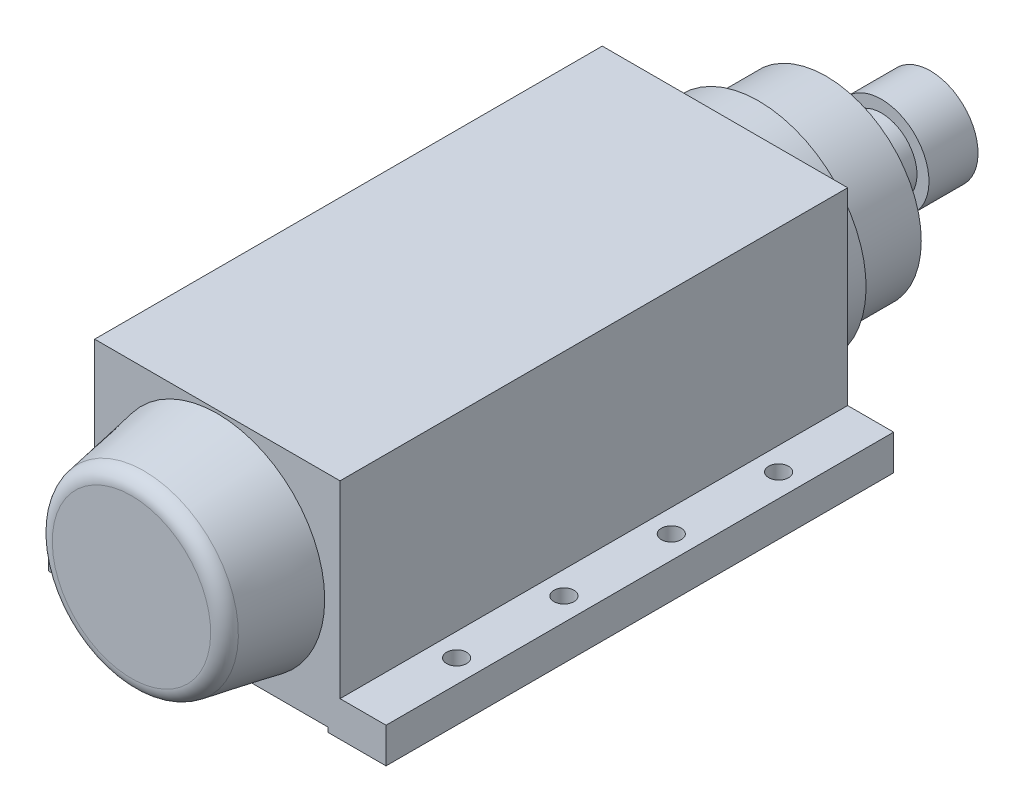
ISO-10303-21;
HEADER;
FILE_DESCRIPTION(('STEP AP214'),'2;1');
FILE_NAME('part.step','',(''),(''),'','','');
FILE_SCHEMA(('AUTOMOTIVE_DESIGN { 1 0 10303 214 1 1 1 1 }'));
ENDSEC;
DATA;
#1=APPLICATION_CONTEXT('core data for automotive mechanical design processes');
#2=APPLICATION_PROTOCOL_DEFINITION('international standard','automotive_design',2000,#1);
#3=PRODUCT_CONTEXT('',#1,'mechanical');
#4=PRODUCT('Part','Part','',(#3));
#5=PRODUCT_RELATED_PRODUCT_CATEGORY('part','',(#4));
#6=PRODUCT_DEFINITION_FORMATION('','',#4);
#7=PRODUCT_DEFINITION_CONTEXT('part definition',#1,'design');
#8=PRODUCT_DEFINITION('design','',#6,#7);
#9=PRODUCT_DEFINITION_SHAPE('','',#8);
#10=(LENGTH_UNIT() NAMED_UNIT(*) SI_UNIT(.MILLI.,.METRE.));
#11=(NAMED_UNIT(*) PLANE_ANGLE_UNIT() SI_UNIT($,.RADIAN.));
#12=(NAMED_UNIT(*) SI_UNIT($,.STERADIAN.) SOLID_ANGLE_UNIT());
#13=UNCERTAINTY_MEASURE_WITH_UNIT(LENGTH_MEASURE(1.E-05),#10,'distance_accuracy_value','');
#14=(GEOMETRIC_REPRESENTATION_CONTEXT(3) GLOBAL_UNCERTAINTY_ASSIGNED_CONTEXT((#13)) GLOBAL_UNIT_ASSIGNED_CONTEXT((#10,
#11,#12)) REPRESENTATION_CONTEXT('',''));
#15=CARTESIAN_POINT('',(0.,0.,0.));
#16=DIRECTION('',(0.,0.,1.));
#17=DIRECTION('',(1.,0.,0.));
#18=AXIS2_PLACEMENT_3D('',#15,#16,#17);
#19=CARTESIAN_POINT('',(36.,1.5,165.5));
#20=DIRECTION('',(1.,0.,0.));
#21=DIRECTION('',(0.,0.,-1.));
#22=AXIS2_PLACEMENT_3D('',#19,#20,#21);
#23=PLANE('',#22);
#24=DIRECTION('',(0.,-1.,0.));
#25=VECTOR('',#24,1.);
#26=CARTESIAN_POINT('',(36.,1.5,0.));
#27=LINE('',#26,#25);
#28=CARTESIAN_POINT('',(36.,1.5,0.));
#29=VERTEX_POINT('',#28);
#30=CARTESIAN_POINT('',(36.,0.,0.));
#31=VERTEX_POINT('',#30);
#32=EDGE_CURVE('E158',#29,#31,#27,.T.);
#33=ORIENTED_EDGE('',*,*,#32,.T.);
#34=DIRECTION('',(0.,0.,-1.));
#35=VECTOR('',#34,1.);
#36=CARTESIAN_POINT('',(36.,0.,165.5));
#37=LINE('',#36,#35);
#38=CARTESIAN_POINT('',(36.,0.,165.5));
#39=VERTEX_POINT('',#38);
#40=EDGE_CURVE('E44',#39,#31,#37,.T.);
#41=ORIENTED_EDGE('',*,*,#40,.F.);
#42=DIRECTION('',(0.,-1.,0.));
#43=VECTOR('',#42,1.);
#44=CARTESIAN_POINT('',(36.,1.5,165.5));
#45=LINE('',#44,#43);
#46=CARTESIAN_POINT('',(36.,1.5,165.5));
#47=VERTEX_POINT('',#46);
#48=EDGE_CURVE('E181',#47,#39,#45,.T.);
#49=ORIENTED_EDGE('',*,*,#48,.F.);
#50=DIRECTION('',(0.,0.,-1.));
#51=VECTOR('',#50,1.);
#52=CARTESIAN_POINT('',(36.,1.5,165.5));
#53=LINE('',#52,#51);
#54=EDGE_CURVE('E154',#47,#29,#53,.T.);
#55=ORIENTED_EDGE('',*,*,#54,.T.);
#56=EDGE_LOOP('',(#33,#41,#49,#55));
#57=FACE_BOUND('',#56,.T.);
#58=ADVANCED_FACE('F35',(#57),#23,.F.);
#59=CARTESIAN_POINT('',(36.,0.,165.5));
#60=DIRECTION('',(0.,1.,0.));
#61=DIRECTION('',(-1.,0.,0.));
#62=AXIS2_PLACEMENT_3D('',#59,#60,#61);
#63=PLANE('',#62);
#64=CARTESIAN_POINT('',(47.5,0.,135.));
#65=DIRECTION('',(0.,-1.,0.));
#66=DIRECTION('',(1.,0.,0.));
#67=AXIS2_PLACEMENT_3D('',#64,#65,#66);
#68=CIRCLE('',#67,3.25);
#69=CARTESIAN_POINT('',(50.75,0.,135.));
#70=VERTEX_POINT('',#69);
#71=EDGE_CURVE('E363',#70,#70,#68,.T.);
#72=ORIENTED_EDGE('',*,*,#71,.F.);
#73=EDGE_LOOP('',(#72));
#74=FACE_BOUND('',#73,.T.);
#75=CARTESIAN_POINT('',(47.5,0.,100.));
#76=DIRECTION('',(0.,-1.,0.));
#77=DIRECTION('',(1.,0.,0.));
#78=AXIS2_PLACEMENT_3D('',#75,#76,#77);
#79=CIRCLE('',#78,3.25);
#80=CARTESIAN_POINT('',(50.75,0.,100.));
#81=VERTEX_POINT('',#80);
#82=EDGE_CURVE('E366',#81,#81,#79,.T.);
#83=ORIENTED_EDGE('',*,*,#82,.F.);
#84=EDGE_LOOP('',(#83));
#85=FACE_BOUND('',#84,.T.);
#86=CARTESIAN_POINT('',(47.5,0.,65.));
#87=DIRECTION('',(0.,-1.,0.));
#88=DIRECTION('',(1.,0.,0.));
#89=AXIS2_PLACEMENT_3D('',#86,#87,#88);
#90=CIRCLE('',#89,3.25);
#91=CARTESIAN_POINT('',(50.75,0.,65.));
#92=VERTEX_POINT('',#91);
#93=EDGE_CURVE('E368',#92,#92,#90,.T.);
#94=ORIENTED_EDGE('',*,*,#93,.F.);
#95=EDGE_LOOP('',(#94));
#96=FACE_BOUND('',#95,.T.);
#97=CARTESIAN_POINT('',(47.5,0.,30.));
#98=DIRECTION('',(0.,-1.,0.));
#99=DIRECTION('',(1.,0.,0.));
#100=AXIS2_PLACEMENT_3D('',#97,#98,#99);
#101=CIRCLE('',#100,3.25);
#102=CARTESIAN_POINT('',(50.75,0.,30.));
#103=VERTEX_POINT('',#102);
#104=EDGE_CURVE('E371',#103,#103,#101,.T.);
#105=ORIENTED_EDGE('',*,*,#104,.F.);
#106=EDGE_LOOP('',(#105));
#107=FACE_BOUND('',#106,.T.);
#108=DIRECTION('',(1.,0.,0.));
#109=VECTOR('',#108,1.);
#110=CARTESIAN_POINT('',(36.,0.,0.));
#111=LINE('',#110,#109);
#112=CARTESIAN_POINT('',(55.,0.,0.));
#113=VERTEX_POINT('',#112);
#114=EDGE_CURVE('E161',#31,#113,#111,.T.);
#115=ORIENTED_EDGE('',*,*,#114,.T.);
#116=DIRECTION('',(0.,0.,-1.));
#117=VECTOR('',#116,1.);
#118=CARTESIAN_POINT('',(55.,0.,165.5));
#119=LINE('',#118,#117);
#120=CARTESIAN_POINT('',(55.,0.,165.5));
#121=VERTEX_POINT('',#120);
#122=EDGE_CURVE('E203',#121,#113,#119,.T.);
#123=ORIENTED_EDGE('',*,*,#122,.F.);
#124=DIRECTION('',(1.,0.,0.));
#125=VECTOR('',#124,1.);
#126=CARTESIAN_POINT('',(36.,0.,165.5));
#127=LINE('',#126,#125);
#128=EDGE_CURVE('E109',#39,#121,#127,.T.);
#129=ORIENTED_EDGE('',*,*,#128,.F.);
#130=ORIENTED_EDGE('',*,*,#40,.T.);
#131=EDGE_LOOP('',(#115,#123,#129,#130));
#132=FACE_BOUND('',#131,.T.);
#133=ADVANCED_FACE('F305',(#74,#85,#96,#107,#132),#63,.F.);
#134=CARTESIAN_POINT('',(55.,0.,165.5));
#135=DIRECTION('',(-1.,0.,0.));
#136=DIRECTION('',(0.,-1.,0.));
#137=AXIS2_PLACEMENT_3D('',#134,#135,#136);
#138=PLANE('',#137);
#139=DIRECTION('',(0.,1.,0.));
#140=VECTOR('',#139,1.);
#141=CARTESIAN_POINT('',(55.,0.,0.));
#142=LINE('',#141,#140);
#143=CARTESIAN_POINT('',(55.,11.5,0.));
#144=VERTEX_POINT('',#143);
#145=EDGE_CURVE('E164',#113,#144,#142,.T.);
#146=ORIENTED_EDGE('',*,*,#145,.T.);
#147=DIRECTION('',(0.,0.,-1.));
#148=VECTOR('',#147,1.);
#149=CARTESIAN_POINT('',(55.,11.5,165.5));
#150=LINE('',#149,#148);
#151=CARTESIAN_POINT('',(55.,11.5,165.5));
#152=VERTEX_POINT('',#151);
#153=EDGE_CURVE('E200',#152,#144,#150,.T.);
#154=ORIENTED_EDGE('',*,*,#153,.F.);
#155=DIRECTION('',(0.,1.,0.));
#156=VECTOR('',#155,1.);
#157=CARTESIAN_POINT('',(55.,0.,165.5));
#158=LINE('',#157,#156);
#159=EDGE_CURVE('E265',#121,#152,#158,.T.);
#160=ORIENTED_EDGE('',*,*,#159,.F.);
#161=ORIENTED_EDGE('',*,*,#122,.T.);
#162=EDGE_LOOP('',(#146,#154,#160,#161));
#163=FACE_BOUND('',#162,.T.);
#164=ADVANCED_FACE('F309',(#163),#138,.F.);
#165=CARTESIAN_POINT('',(55.,11.5,165.5));
#166=DIRECTION('',(0.,-1.,0.));
#167=DIRECTION('',(1.,0.,0.));
#168=AXIS2_PLACEMENT_3D('',#165,#166,#167);
#169=PLANE('',#168);
#170=CARTESIAN_POINT('',(47.5,11.5,135.));
#171=DIRECTION('',(0.,-1.,0.));
#172=DIRECTION('',(1.,0.,0.));
#173=AXIS2_PLACEMENT_3D('',#170,#171,#172);
#174=CIRCLE('',#173,3.25);
#175=CARTESIAN_POINT('',(50.75,11.5,135.));
#176=VERTEX_POINT('',#175);
#177=EDGE_CURVE('E38',#176,#176,#174,.T.);
#178=ORIENTED_EDGE('',*,*,#177,.T.);
#179=EDGE_LOOP('',(#178));
#180=FACE_BOUND('',#179,.T.);
#181=CARTESIAN_POINT('',(47.5,11.5,100.));
#182=DIRECTION('',(0.,-1.,0.));
#183=DIRECTION('',(1.,0.,0.));
#184=AXIS2_PLACEMENT_3D('',#181,#182,#183);
#185=CIRCLE('',#184,3.25);
#186=CARTESIAN_POINT('',(50.75,11.5,100.));
#187=VERTEX_POINT('',#186);
#188=EDGE_CURVE('E213',#187,#187,#185,.T.);
#189=ORIENTED_EDGE('',*,*,#188,.T.);
#190=EDGE_LOOP('',(#189));
#191=FACE_BOUND('',#190,.T.);
#192=CARTESIAN_POINT('',(47.5,11.5,65.));
#193=DIRECTION('',(0.,-1.,0.));
#194=DIRECTION('',(1.,0.,0.));
#195=AXIS2_PLACEMENT_3D('',#192,#193,#194);
#196=CIRCLE('',#195,3.25);
#197=CARTESIAN_POINT('',(50.75,11.5,65.));
#198=VERTEX_POINT('',#197);
#199=EDGE_CURVE('E210',#198,#198,#196,.T.);
#200=ORIENTED_EDGE('',*,*,#199,.T.);
#201=EDGE_LOOP('',(#200));
#202=FACE_BOUND('',#201,.T.);
#203=CARTESIAN_POINT('',(47.5,11.5,30.));
#204=DIRECTION('',(0.,-1.,0.));
#205=DIRECTION('',(1.,0.,0.));
#206=AXIS2_PLACEMENT_3D('',#203,#204,#205);
#207=CIRCLE('',#206,3.25);
#208=CARTESIAN_POINT('',(50.75,11.5,30.));
#209=VERTEX_POINT('',#208);
#210=EDGE_CURVE('E207',#209,#209,#207,.T.);
#211=ORIENTED_EDGE('',*,*,#210,.T.);
#212=EDGE_LOOP('',(#211));
#213=FACE_BOUND('',#212,.T.);
#214=DIRECTION('',(-1.,0.,0.));
#215=VECTOR('',#214,1.);
#216=CARTESIAN_POINT('',(55.,11.5,0.));
#217=LINE('',#216,#215);
#218=CARTESIAN_POINT('',(40.,11.5,0.));
#219=VERTEX_POINT('',#218);
#220=EDGE_CURVE('E166',#144,#219,#217,.T.);
#221=ORIENTED_EDGE('',*,*,#220,.T.);
#222=DIRECTION('',(0.,0.,-1.));
#223=VECTOR('',#222,1.);
#224=CARTESIAN_POINT('',(40.,11.5,165.5));
#225=LINE('',#224,#223);
#226=CARTESIAN_POINT('',(40.,11.5,165.5));
#227=VERTEX_POINT('',#226);
#228=EDGE_CURVE('E197',#227,#219,#225,.T.);
#229=ORIENTED_EDGE('',*,*,#228,.F.);
#230=DIRECTION('',(-1.,0.,0.));
#231=VECTOR('',#230,1.);
#232=CARTESIAN_POINT('',(55.,11.5,165.5));
#233=LINE('',#232,#231);
#234=EDGE_CURVE('E267',#152,#227,#233,.T.);
#235=ORIENTED_EDGE('',*,*,#234,.F.);
#236=ORIENTED_EDGE('',*,*,#153,.T.);
#237=EDGE_LOOP('',(#221,#229,#235,#236));
#238=FACE_BOUND('',#237,.T.);
#239=ADVANCED_FACE('F314',(#180,#191,#202,#213,#238),#169,.F.);
#240=CARTESIAN_POINT('',(40.,11.5,165.5));
#241=DIRECTION('',(-1.,0.,0.));
#242=DIRECTION('',(0.,-1.,0.));
#243=AXIS2_PLACEMENT_3D('',#240,#241,#242);
#244=PLANE('',#243);
#245=DIRECTION('',(0.,1.,0.));
#246=VECTOR('',#245,1.);
#247=CARTESIAN_POINT('',(40.,11.5,0.));
#248=LINE('',#247,#246);
#249=CARTESIAN_POINT('',(40.,73.,0.));
#250=VERTEX_POINT('',#249);
#251=EDGE_CURVE('E168',#219,#250,#248,.T.);
#252=ORIENTED_EDGE('',*,*,#251,.T.);
#253=DIRECTION('',(0.,0.,-1.));
#254=VECTOR('',#253,1.);
#255=CARTESIAN_POINT('',(40.,73.,165.5));
#256=LINE('',#255,#254);
#257=CARTESIAN_POINT('',(40.,73.,165.5));
#258=VERTEX_POINT('',#257);
#259=EDGE_CURVE('E194',#258,#250,#256,.T.);
#260=ORIENTED_EDGE('',*,*,#259,.F.);
#261=DIRECTION('',(0.,1.,0.));
#262=VECTOR('',#261,1.);
#263=CARTESIAN_POINT('',(40.,11.5,165.5));
#264=LINE('',#263,#262);
#265=EDGE_CURVE('E269',#227,#258,#264,.T.);
#266=ORIENTED_EDGE('',*,*,#265,.F.);
#267=ORIENTED_EDGE('',*,*,#228,.T.);
#268=EDGE_LOOP('',(#252,#260,#266,#267));
#269=FACE_BOUND('',#268,.T.);
#270=ADVANCED_FACE('F322',(#269),#244,.F.);
#271=CARTESIAN_POINT('',(40.,73.,165.5));
#272=DIRECTION('',(0.,-1.,0.));
#273=DIRECTION('',(0.,0.,-1.));
#274=AXIS2_PLACEMENT_3D('',#271,#272,#273);
#275=PLANE('',#274);
#276=DIRECTION('',(-1.,0.,0.));
#277=VECTOR('',#276,1.);
#278=CARTESIAN_POINT('',(40.,73.,0.));
#279=LINE('',#278,#277);
#280=CARTESIAN_POINT('',(-40.,73.,0.));
#281=VERTEX_POINT('',#280);
#282=EDGE_CURVE('E170',#250,#281,#279,.T.);
#283=ORIENTED_EDGE('',*,*,#282,.T.);
#284=DIRECTION('',(0.,0.,-1.));
#285=VECTOR('',#284,1.);
#286=CARTESIAN_POINT('',(-40.,73.,165.5));
#287=LINE('',#286,#285);
#288=CARTESIAN_POINT('',(-40.,73.,165.5));
#289=VERTEX_POINT('',#288);
#290=EDGE_CURVE('E191',#289,#281,#287,.T.);
#291=ORIENTED_EDGE('',*,*,#290,.F.);
#292=DIRECTION('',(-1.,0.,0.));
#293=VECTOR('',#292,1.);
#294=CARTESIAN_POINT('',(40.,73.,165.5));
#295=LINE('',#294,#293);
#296=EDGE_CURVE('E271',#258,#289,#295,.T.);
#297=ORIENTED_EDGE('',*,*,#296,.F.);
#298=ORIENTED_EDGE('',*,*,#259,.T.);
#299=EDGE_LOOP('',(#283,#291,#297,#298));
#300=FACE_BOUND('',#299,.T.);
#301=ADVANCED_FACE('F325',(#300),#275,.F.);
#302=CARTESIAN_POINT('',(-40.,11.5,165.5));
#303=DIRECTION('',(1.,0.,0.));
#304=DIRECTION('',(0.,1.,0.));
#305=AXIS2_PLACEMENT_3D('',#302,#303,#304);
#306=PLANE('',#305);
#307=DIRECTION('',(0.,-1.,0.));
#308=VECTOR('',#307,1.);
#309=CARTESIAN_POINT('',(-40.,11.5,0.));
#310=LINE('',#309,#308);
#311=CARTESIAN_POINT('',(-40.,11.5,0.));
#312=VERTEX_POINT('',#311);
#313=EDGE_CURVE('E172',#281,#312,#310,.T.);
#314=ORIENTED_EDGE('',*,*,#313,.T.);
#315=DIRECTION('',(0.,0.,-1.));
#316=VECTOR('',#315,1.);
#317=CARTESIAN_POINT('',(-40.,11.5,165.5));
#318=LINE('',#317,#316);
#319=CARTESIAN_POINT('',(-40.,11.5,165.5));
#320=VERTEX_POINT('',#319);
#321=EDGE_CURVE('E188',#320,#312,#318,.T.);
#322=ORIENTED_EDGE('',*,*,#321,.F.);
#323=DIRECTION('',(0.,-1.,0.));
#324=VECTOR('',#323,1.);
#325=CARTESIAN_POINT('',(-40.,11.5,165.5));
#326=LINE('',#325,#324);
#327=EDGE_CURVE('E273',#289,#320,#326,.T.);
#328=ORIENTED_EDGE('',*,*,#327,.F.);
#329=ORIENTED_EDGE('',*,*,#290,.T.);
#330=EDGE_LOOP('',(#314,#322,#328,#329));
#331=FACE_BOUND('',#330,.T.);
#332=ADVANCED_FACE('F329',(#331),#306,.F.);
#333=CARTESIAN_POINT('',(-55.,11.5,165.5));
#334=DIRECTION('',(0.,-1.,0.));
#335=DIRECTION('',(1.,0.,0.));
#336=AXIS2_PLACEMENT_3D('',#333,#334,#335);
#337=PLANE('',#336);
#338=CARTESIAN_POINT('',(-47.5,11.5,30.));
#339=DIRECTION('',(0.,-1.,0.));
#340=DIRECTION('',(1.,0.,0.));
#341=AXIS2_PLACEMENT_3D('',#338,#339,#340);
#342=CIRCLE('',#341,3.25);
#343=CARTESIAN_POINT('',(-44.25,11.5,30.));
#344=VERTEX_POINT('',#343);
#345=EDGE_CURVE('E211',#344,#344,#342,.T.);
#346=ORIENTED_EDGE('',*,*,#345,.T.);
#347=EDGE_LOOP('',(#346));
#348=FACE_BOUND('',#347,.T.);
#349=CARTESIAN_POINT('',(-47.5,11.5,65.));
#350=DIRECTION('',(0.,-1.,0.));
#351=DIRECTION('',(1.,0.,0.));
#352=AXIS2_PLACEMENT_3D('',#349,#350,#351);
#353=CIRCLE('',#352,3.25);
#354=CARTESIAN_POINT('',(-44.25,11.5,65.));
#355=VERTEX_POINT('',#354);
#356=EDGE_CURVE('E381',#355,#355,#353,.T.);
#357=ORIENTED_EDGE('',*,*,#356,.T.);
#358=EDGE_LOOP('',(#357));
#359=FACE_BOUND('',#358,.T.);
#360=CARTESIAN_POINT('',(-47.5,11.5,100.));
#361=DIRECTION('',(0.,-1.,0.));
#362=DIRECTION('',(1.,0.,0.));
#363=AXIS2_PLACEMENT_3D('',#360,#361,#362);
#364=CIRCLE('',#363,3.25);
#365=CARTESIAN_POINT('',(-44.25,11.5,100.));
#366=VERTEX_POINT('',#365);
#367=EDGE_CURVE('E379',#366,#366,#364,.T.);
#368=ORIENTED_EDGE('',*,*,#367,.T.);
#369=EDGE_LOOP('',(#368));
#370=FACE_BOUND('',#369,.T.);
#371=CARTESIAN_POINT('',(-47.5,11.5,135.));
#372=DIRECTION('',(0.,-1.,0.));
#373=DIRECTION('',(1.,0.,0.));
#374=AXIS2_PLACEMENT_3D('',#371,#372,#373);
#375=CIRCLE('',#374,3.25);
#376=CARTESIAN_POINT('',(-44.25,11.5,135.));
#377=VERTEX_POINT('',#376);
#378=EDGE_CURVE('E376',#377,#377,#375,.T.);
#379=ORIENTED_EDGE('',*,*,#378,.T.);
#380=EDGE_LOOP('',(#379));
#381=FACE_BOUND('',#380,.T.);
#382=DIRECTION('',(-1.,0.,0.));
#383=VECTOR('',#382,1.);
#384=CARTESIAN_POINT('',(-55.,11.5,0.));
#385=LINE('',#384,#383);
#386=CARTESIAN_POINT('',(-55.,11.5,0.));
#387=VERTEX_POINT('',#386);
#388=EDGE_CURVE('E174',#312,#387,#385,.T.);
#389=ORIENTED_EDGE('',*,*,#388,.T.);
#390=DIRECTION('',(0.,0.,-1.));
#391=VECTOR('',#390,1.);
#392=CARTESIAN_POINT('',(-55.,11.5,165.5));
#393=LINE('',#392,#391);
#394=CARTESIAN_POINT('',(-55.,11.5,165.5));
#395=VERTEX_POINT('',#394);
#396=EDGE_CURVE('E185',#395,#387,#393,.T.);
#397=ORIENTED_EDGE('',*,*,#396,.F.);
#398=DIRECTION('',(-1.,0.,0.));
#399=VECTOR('',#398,1.);
#400=CARTESIAN_POINT('',(-55.,11.5,165.5));
#401=LINE('',#400,#399);
#402=EDGE_CURVE('E275',#320,#395,#401,.T.);
#403=ORIENTED_EDGE('',*,*,#402,.F.);
#404=ORIENTED_EDGE('',*,*,#321,.T.);
#405=EDGE_LOOP('',(#389,#397,#403,#404));
#406=FACE_BOUND('',#405,.T.);
#407=ADVANCED_FACE('F281',(#348,#359,#370,#381,#406),#337,.F.);
#408=CARTESIAN_POINT('',(-55.,0.,165.5));
#409=DIRECTION('',(1.,0.,0.));
#410=DIRECTION('',(0.,1.,0.));
#411=AXIS2_PLACEMENT_3D('',#408,#409,#410);
#412=PLANE('',#411);
#413=DIRECTION('',(0.,-1.,0.));
#414=VECTOR('',#413,1.);
#415=CARTESIAN_POINT('',(-55.,0.,0.));
#416=LINE('',#415,#414);
#417=CARTESIAN_POINT('',(-55.,0.,0.));
#418=VERTEX_POINT('',#417);
#419=EDGE_CURVE('E176',#387,#418,#416,.T.);
#420=ORIENTED_EDGE('',*,*,#419,.T.);
#421=DIRECTION('',(0.,0.,-1.));
#422=VECTOR('',#421,1.);
#423=CARTESIAN_POINT('',(-55.,0.,165.5));
#424=LINE('',#423,#422);
#425=CARTESIAN_POINT('',(-55.,0.,165.5));
#426=VERTEX_POINT('',#425);
#427=EDGE_CURVE('E149',#426,#418,#424,.T.);
#428=ORIENTED_EDGE('',*,*,#427,.F.);
#429=DIRECTION('',(0.,-1.,0.));
#430=VECTOR('',#429,1.);
#431=CARTESIAN_POINT('',(-55.,0.,165.5));
#432=LINE('',#431,#430);
#433=EDGE_CURVE('E140',#395,#426,#432,.T.);
#434=ORIENTED_EDGE('',*,*,#433,.F.);
#435=ORIENTED_EDGE('',*,*,#396,.T.);
#436=EDGE_LOOP('',(#420,#428,#434,#435));
#437=FACE_BOUND('',#436,.T.);
#438=ADVANCED_FACE('F285',(#437),#412,.F.);
#439=CARTESIAN_POINT('',(-36.,0.,165.5));
#440=DIRECTION('',(0.,1.,0.));
#441=DIRECTION('',(-1.,0.,0.));
#442=AXIS2_PLACEMENT_3D('',#439,#440,#441);
#443=PLANE('',#442);
#444=CARTESIAN_POINT('',(-47.5,0.,30.));
#445=DIRECTION('',(0.,-1.,0.));
#446=DIRECTION('',(-1.,0.,0.));
#447=AXIS2_PLACEMENT_3D('',#444,#445,#446);
#448=CIRCLE('',#447,3.25);
#449=CARTESIAN_POINT('',(-50.75,0.,30.));
#450=VERTEX_POINT('',#449);
#451=EDGE_CURVE('E346',#450,#450,#448,.T.);
#452=ORIENTED_EDGE('',*,*,#451,.F.);
#453=EDGE_LOOP('',(#452));
#454=FACE_BOUND('',#453,.T.);
#455=CARTESIAN_POINT('',(-47.5,0.,65.));
#456=DIRECTION('',(0.,-1.,0.));
#457=DIRECTION('',(-1.,0.,0.));
#458=AXIS2_PLACEMENT_3D('',#455,#456,#457);
#459=CIRCLE('',#458,3.25);
#460=CARTESIAN_POINT('',(-50.75,0.,65.));
#461=VERTEX_POINT('',#460);
#462=EDGE_CURVE('E350',#461,#461,#459,.T.);
#463=ORIENTED_EDGE('',*,*,#462,.F.);
#464=EDGE_LOOP('',(#463));
#465=FACE_BOUND('',#464,.T.);
#466=CARTESIAN_POINT('',(-47.5,0.,100.));
#467=DIRECTION('',(0.,-1.,0.));
#468=DIRECTION('',(-1.,0.,0.));
#469=AXIS2_PLACEMENT_3D('',#466,#467,#468);
#470=CIRCLE('',#469,3.25);
#471=CARTESIAN_POINT('',(-50.75,0.,100.));
#472=VERTEX_POINT('',#471);
#473=EDGE_CURVE('E354',#472,#472,#470,.T.);
#474=ORIENTED_EDGE('',*,*,#473,.F.);
#475=EDGE_LOOP('',(#474));
#476=FACE_BOUND('',#475,.T.);
#477=CARTESIAN_POINT('',(-47.5,0.,135.));
#478=DIRECTION('',(0.,-1.,0.));
#479=DIRECTION('',(-1.,0.,0.));
#480=AXIS2_PLACEMENT_3D('',#477,#478,#479);
#481=CIRCLE('',#480,3.25);
#482=CARTESIAN_POINT('',(-50.75,0.,135.));
#483=VERTEX_POINT('',#482);
#484=EDGE_CURVE('E357',#483,#483,#481,.T.);
#485=ORIENTED_EDGE('',*,*,#484,.F.);
#486=EDGE_LOOP('',(#485));
#487=FACE_BOUND('',#486,.T.);
#488=DIRECTION('',(1.,0.,0.));
#489=VECTOR('',#488,1.);
#490=CARTESIAN_POINT('',(-36.,0.,0.));
#491=LINE('',#490,#489);
#492=CARTESIAN_POINT('',(-36.,0.,0.));
#493=VERTEX_POINT('',#492);
#494=EDGE_CURVE('E148',#418,#493,#491,.T.);
#495=ORIENTED_EDGE('',*,*,#494,.T.);
#496=DIRECTION('',(0.,0.,-1.));
#497=VECTOR('',#496,1.);
#498=CARTESIAN_POINT('',(-36.,0.,165.5));
#499=LINE('',#498,#497);
#500=CARTESIAN_POINT('',(-36.,0.,165.5));
#501=VERTEX_POINT('',#500);
#502=EDGE_CURVE('E145',#501,#493,#499,.T.);
#503=ORIENTED_EDGE('',*,*,#502,.F.);
#504=DIRECTION('',(1.,0.,0.));
#505=VECTOR('',#504,1.);
#506=CARTESIAN_POINT('',(-36.,0.,165.5));
#507=LINE('',#506,#505);
#508=EDGE_CURVE('E134',#426,#501,#507,.T.);
#509=ORIENTED_EDGE('',*,*,#508,.F.);
#510=ORIENTED_EDGE('',*,*,#427,.T.);
#511=EDGE_LOOP('',(#495,#503,#509,#510));
#512=FACE_BOUND('',#511,.T.);
#513=ADVANCED_FACE('F146',(#454,#465,#476,#487,#512),#443,.F.);
#514=CARTESIAN_POINT('',(-36.,1.5,165.5));
#515=DIRECTION('',(-1.,0.,0.));
#516=DIRECTION('',(0.,0.,1.));
#517=AXIS2_PLACEMENT_3D('',#514,#515,#516);
#518=PLANE('',#517);
#519=DIRECTION('',(0.,1.,0.));
#520=VECTOR('',#519,1.);
#521=CARTESIAN_POINT('',(-36.,1.5,0.));
#522=LINE('',#521,#520);
#523=CARTESIAN_POINT('',(-36.,1.5,0.));
#524=VERTEX_POINT('',#523);
#525=EDGE_CURVE('E94',#493,#524,#522,.T.);
#526=ORIENTED_EDGE('',*,*,#525,.T.);
#527=DIRECTION('',(0.,0.,-1.));
#528=VECTOR('',#527,1.);
#529=CARTESIAN_POINT('',(-36.,1.5,165.5));
#530=LINE('',#529,#528);
#531=CARTESIAN_POINT('',(-36.,1.5,165.5));
#532=VERTEX_POINT('',#531);
#533=EDGE_CURVE('E150',#532,#524,#530,.T.);
#534=ORIENTED_EDGE('',*,*,#533,.F.);
#535=DIRECTION('',(0.,1.,0.));
#536=VECTOR('',#535,1.);
#537=CARTESIAN_POINT('',(-36.,1.5,165.5));
#538=LINE('',#537,#536);
#539=EDGE_CURVE('E138',#501,#532,#538,.T.);
#540=ORIENTED_EDGE('',*,*,#539,.F.);
#541=ORIENTED_EDGE('',*,*,#502,.T.);
#542=EDGE_LOOP('',(#526,#534,#540,#541));
#543=FACE_BOUND('',#542,.T.);
#544=ADVANCED_FACE('F152',(#543),#518,.F.);
#545=CARTESIAN_POINT('',(-36.,1.5,165.5));
#546=DIRECTION('',(0.,1.,0.));
#547=DIRECTION('',(0.,0.,1.));
#548=AXIS2_PLACEMENT_3D('',#545,#546,#547);
#549=PLANE('',#548);
#550=DIRECTION('',(1.,0.,0.));
#551=VECTOR('',#550,1.);
#552=CARTESIAN_POINT('',(-36.,1.5,0.));
#553=LINE('',#552,#551);
#554=EDGE_CURVE('E100',#524,#29,#553,.T.);
#555=ORIENTED_EDGE('',*,*,#554,.T.);
#556=ORIENTED_EDGE('',*,*,#54,.F.);
#557=DIRECTION('',(1.,0.,0.));
#558=VECTOR('',#557,1.);
#559=CARTESIAN_POINT('',(-36.,1.5,165.5));
#560=LINE('',#559,#558);
#561=EDGE_CURVE('E53',#532,#47,#560,.T.);
#562=ORIENTED_EDGE('',*,*,#561,.F.);
#563=ORIENTED_EDGE('',*,*,#533,.T.);
#564=EDGE_LOOP('',(#555,#556,#562,#563));
#565=FACE_BOUND('',#564,.T.);
#566=ADVANCED_FACE('F293',(#565),#549,.F.);
#567=CARTESIAN_POINT('',(0.,0.,165.5));
#568=DIRECTION('',(0.,0.,1.));
#569=DIRECTION('',(1.,0.,0.));
#570=AXIS2_PLACEMENT_3D('',#567,#568,#569);
#571=PLANE('',#570);
#572=CARTESIAN_POINT('',(0.,37.,165.5));
#573=DIRECTION('',(0.,0.,1.));
#574=DIRECTION('',(1.,0.,0.));
#575=AXIS2_PLACEMENT_3D('',#572,#573,#574);
#576=CIRCLE('',#575,35.);
#577=CARTESIAN_POINT('',(35.,37.,165.5));
#578=VERTEX_POINT('',#577);
#579=EDGE_CURVE('E11',#578,#578,#576,.T.);
#580=ORIENTED_EDGE('',*,*,#579,.F.);
#581=EDGE_LOOP('',(#580));
#582=FACE_BOUND('',#581,.T.);
#583=ORIENTED_EDGE('',*,*,#48,.T.);
#584=ORIENTED_EDGE('',*,*,#128,.T.);
#585=ORIENTED_EDGE('',*,*,#159,.T.);
#586=ORIENTED_EDGE('',*,*,#234,.T.);
#587=ORIENTED_EDGE('',*,*,#265,.T.);
#588=ORIENTED_EDGE('',*,*,#296,.T.);
#589=ORIENTED_EDGE('',*,*,#327,.T.);
#590=ORIENTED_EDGE('',*,*,#402,.T.);
#591=ORIENTED_EDGE('',*,*,#433,.T.);
#592=ORIENTED_EDGE('',*,*,#508,.T.);
#593=ORIENTED_EDGE('',*,*,#539,.T.);
#594=ORIENTED_EDGE('',*,*,#561,.T.);
#595=EDGE_LOOP('',(#583,#584,#585,#586,#587,#588,#589,#590,#591,#592,#593,#594));
#596=FACE_BOUND('',#595,.T.);
#597=ADVANCED_FACE('F136',(#582,#596),#571,.T.);
#598=CARTESIAN_POINT('',(0.,0.,0.));
#599=DIRECTION('',(0.,0.,1.));
#600=DIRECTION('',(1.,0.,0.));
#601=AXIS2_PLACEMENT_3D('',#598,#599,#600);
#602=PLANE('',#601);
#603=CARTESIAN_POINT('',(0.,37.,0.));
#604=DIRECTION('',(0.,0.,-1.));
#605=DIRECTION('',(0.,1.,0.));
#606=AXIS2_PLACEMENT_3D('',#603,#604,#605);
#607=CIRCLE('',#606,35.);
#608=CARTESIAN_POINT('',(0.,72.,0.));
#609=VERTEX_POINT('',#608);
#610=EDGE_CURVE('E240',#609,#609,#607,.T.);
#611=ORIENTED_EDGE('',*,*,#610,.F.);
#612=EDGE_LOOP('',(#611));
#613=FACE_BOUND('',#612,.T.);
#614=ORIENTED_EDGE('',*,*,#32,.F.);
#615=ORIENTED_EDGE('',*,*,#554,.F.);
#616=ORIENTED_EDGE('',*,*,#525,.F.);
#617=ORIENTED_EDGE('',*,*,#494,.F.);
#618=ORIENTED_EDGE('',*,*,#419,.F.);
#619=ORIENTED_EDGE('',*,*,#388,.F.);
#620=ORIENTED_EDGE('',*,*,#313,.F.);
#621=ORIENTED_EDGE('',*,*,#282,.F.);
#622=ORIENTED_EDGE('',*,*,#251,.F.);
#623=ORIENTED_EDGE('',*,*,#220,.F.);
#624=ORIENTED_EDGE('',*,*,#145,.F.);
#625=ORIENTED_EDGE('',*,*,#114,.F.);
#626=EDGE_LOOP('',(#614,#615,#616,#617,#618,#619,#620,#621,#622,#623,#624,#625));
#627=FACE_BOUND('',#626,.T.);
#628=ADVANCED_FACE('F288',(#613,#627),#602,.F.);
#629=CARTESIAN_POINT('',(0.,37.,165.5));
#630=DIRECTION('',(0.,0.,-1.));
#631=DIRECTION('',(0.,1.,0.));
#632=AXIS2_PLACEMENT_3D('',#629,#630,#631);
#633=CONICAL_SURFACE('',#632,35.,0.176708856070037);
#634=CARTESIAN_POINT('',(0.,37.,189.378953192418));
#635=DIRECTION('',(0.,0.,-1.));
#636=DIRECTION('',(0.,1.,0.));
#637=AXIS2_PLACEMENT_3D('',#634,#635,#636);
#638=CIRCLE('',#637,30.7359012156396);
#639=CARTESIAN_POINT('',(0.,67.7359012156396,189.378953192418));
#640=VERTEX_POINT('',#639);
#641=EDGE_CURVE('E162',#640,#640,#638,.T.);
#642=ORIENTED_EDGE('',*,*,#641,.T.);
#643=EDGE_LOOP('',(#642));
#644=FACE_BOUND('',#643,.T.);
#645=ORIENTED_EDGE('',*,*,#579,.T.);
#646=EDGE_LOOP('',(#645));
#647=FACE_BOUND('',#646,.T.);
#648=ADVANCED_FACE('F466',(#644,#647),#633,.T.);
#649=CARTESIAN_POINT('',(0.,37.,188.5));
#650=DIRECTION('',(0.,0.,-1.));
#651=DIRECTION('',(0.,1.,0.));
#652=AXIS2_PLACEMENT_3D('',#649,#650,#651);
#653=TOROIDAL_SURFACE('',#652,25.8137633380972,5.00000000000001);
#654=CARTESIAN_POINT('',(0.,37.,193.5));
#655=DIRECTION('',(0.,0.,-1.));
#656=DIRECTION('',(0.,1.,0.));
#657=AXIS2_PLACEMENT_3D('',#654,#655,#656);
#658=CIRCLE('',#657,25.8137633380972);
#659=CARTESIAN_POINT('',(0.,62.8137633380971,193.5));
#660=VERTEX_POINT('',#659);
#661=EDGE_CURVE('E258',#660,#660,#658,.T.);
#662=ORIENTED_EDGE('',*,*,#661,.T.);
#663=EDGE_LOOP('',(#662));
#664=FACE_BOUND('',#663,.T.);
#665=ORIENTED_EDGE('',*,*,#641,.F.);
#666=EDGE_LOOP('',(#665));
#667=FACE_BOUND('',#666,.T.);
#668=ADVANCED_FACE('F462',(#664,#667),#653,.T.);
#669=CARTESIAN_POINT('',(0.,62.8137633380971,193.5));
#670=DIRECTION('',(0.,0.,1.));
#671=DIRECTION('',(0.,-1.,0.));
#672=AXIS2_PLACEMENT_3D('',#669,#670,#671);
#673=PLANE('',#672);
#674=ORIENTED_EDGE('',*,*,#661,.F.);
#675=EDGE_LOOP('',(#674));
#676=FACE_BOUND('',#675,.T.);
#677=ADVANCED_FACE('F459',(#676),#673,.T.);
#678=CARTESIAN_POINT('',(0.,37.,-36.));
#679=DIRECTION('',(0.,0.,1.));
#680=DIRECTION('',(0.,-1.,0.));
#681=AXIS2_PLACEMENT_3D('',#678,#679,#680);
#682=CONICAL_SURFACE('',#681,24.4226497308104,0.523598775598299);
#683=CARTESIAN_POINT('',(0.,37.,-35.));
#684=DIRECTION('',(0.,0.,-1.));
#685=DIRECTION('',(0.,1.,0.));
#686=AXIS2_PLACEMENT_3D('',#683,#684,#685);
#687=CIRCLE('',#686,25.);
#688=CARTESIAN_POINT('',(0.,62.,-35.));
#689=VERTEX_POINT('',#688);
#690=EDGE_CURVE('E218',#689,#689,#687,.T.);
#691=ORIENTED_EDGE('',*,*,#690,.T.);
#692=EDGE_LOOP('',(#691));
#693=FACE_BOUND('',#692,.T.);
#694=CARTESIAN_POINT('',(0.,37.,-36.));
#695=DIRECTION('',(0.,0.,-1.));
#696=DIRECTION('',(0.,1.,0.));
#697=AXIS2_PLACEMENT_3D('',#694,#695,#696);
#698=CIRCLE('',#697,24.4226497308104);
#699=CARTESIAN_POINT('',(0.,61.4226497308104,-36.));
#700=VERTEX_POINT('',#699);
#701=EDGE_CURVE('E255',#700,#700,#698,.T.);
#702=ORIENTED_EDGE('',*,*,#701,.F.);
#703=EDGE_LOOP('',(#702));
#704=FACE_BOUND('',#703,.T.);
#705=ADVANCED_FACE('F455',(#693,#704),#682,.T.);
#706=CARTESIAN_POINT('',(0.,61.4226497308104,-36.));
#707=DIRECTION('',(0.,0.,-1.));
#708=DIRECTION('',(0.,1.,0.));
#709=AXIS2_PLACEMENT_3D('',#706,#707,#708);
#710=PLANE('',#709);
#711=ORIENTED_EDGE('',*,*,#701,.T.);
#712=EDGE_LOOP('',(#711));
#713=FACE_BOUND('',#712,.T.);
#714=CARTESIAN_POINT('',(0.,37.,-36.));
#715=DIRECTION('',(0.,0.,-1.));
#716=DIRECTION('',(0.,1.,0.));
#717=AXIS2_PLACEMENT_3D('',#714,#715,#716);
#718=CIRCLE('',#717,11.6);
#719=CARTESIAN_POINT('',(0.,48.6,-36.));
#720=VERTEX_POINT('',#719);
#721=EDGE_CURVE('E252',#720,#720,#718,.T.);
#722=ORIENTED_EDGE('',*,*,#721,.F.);
#723=EDGE_LOOP('',(#722));
#724=FACE_BOUND('',#723,.T.);
#725=ADVANCED_FACE('F451',(#713,#724),#710,.T.);
#726=CARTESIAN_POINT('',(0.,37.,-51.7309196899067));
#727=DIRECTION('',(0.,0.,-1.));
#728=DIRECTION('',(0.,1.,0.));
#729=AXIS2_PLACEMENT_3D('',#726,#727,#728);
#730=CYLINDRICAL_SURFACE('',#729,11.6);
#731=ORIENTED_EDGE('',*,*,#721,.T.);
#732=EDGE_LOOP('',(#731));
#733=FACE_BOUND('',#732,.T.);
#734=CARTESIAN_POINT('',(0.,37.,-51.));
#735=DIRECTION('',(0.,0.,-1.));
#736=DIRECTION('',(0.,1.,0.));
#737=AXIS2_PLACEMENT_3D('',#734,#735,#736);
#738=CIRCLE('',#737,11.6);
#739=CARTESIAN_POINT('',(0.,48.6,-51.));
#740=VERTEX_POINT('',#739);
#741=EDGE_CURVE('E249',#740,#740,#738,.T.);
#742=ORIENTED_EDGE('',*,*,#741,.F.);
#743=EDGE_LOOP('',(#742));
#744=FACE_BOUND('',#743,.T.);
#745=ADVANCED_FACE('F447',(#733,#744),#730,.T.);
#746=CARTESIAN_POINT('',(0.,48.6,-51.));
#747=DIRECTION('',(0.,0.,1.));
#748=DIRECTION('',(0.,-1.,0.));
#749=AXIS2_PLACEMENT_3D('',#746,#747,#748);
#750=PLANE('',#749);
#751=ORIENTED_EDGE('',*,*,#741,.T.);
#752=EDGE_LOOP('',(#751));
#753=FACE_BOUND('',#752,.T.);
#754=CARTESIAN_POINT('',(0.,37.,-51.));
#755=DIRECTION('',(0.,0.,-1.));
#756=DIRECTION('',(0.,1.,0.));
#757=AXIS2_PLACEMENT_3D('',#754,#755,#756);
#758=CIRCLE('',#757,15.5);
#759=CARTESIAN_POINT('',(0.,52.5,-51.));
#760=VERTEX_POINT('',#759);
#761=EDGE_CURVE('E246',#760,#760,#758,.T.);
#762=ORIENTED_EDGE('',*,*,#761,.F.);
#763=EDGE_LOOP('',(#762));
#764=FACE_BOUND('',#763,.T.);
#765=ADVANCED_FACE('F443',(#753,#764),#750,.T.);
#766=CARTESIAN_POINT('',(0.,37.,-51.7309196899067));
#767=DIRECTION('',(0.,0.,-1.));
#768=DIRECTION('',(0.,1.,0.));
#769=AXIS2_PLACEMENT_3D('',#766,#767,#768);
#770=CYLINDRICAL_SURFACE('',#769,15.5);
#771=ORIENTED_EDGE('',*,*,#761,.T.);
#772=EDGE_LOOP('',(#771));
#773=FACE_BOUND('',#772,.T.);
#774=CARTESIAN_POINT('',(0.,37.,-67.));
#775=DIRECTION('',(0.,0.,-1.));
#776=DIRECTION('',(0.,1.,0.));
#777=AXIS2_PLACEMENT_3D('',#774,#775,#776);
#778=CIRCLE('',#777,15.5);
#779=CARTESIAN_POINT('',(0.,52.5,-67.));
#780=VERTEX_POINT('',#779);
#781=EDGE_CURVE('E243',#780,#780,#778,.T.);
#782=ORIENTED_EDGE('',*,*,#781,.F.);
#783=EDGE_LOOP('',(#782));
#784=FACE_BOUND('',#783,.T.);
#785=ADVANCED_FACE('F439',(#773,#784),#770,.T.);
#786=CARTESIAN_POINT('',(0.,52.5,-67.));
#787=DIRECTION('',(0.,0.,-1.));
#788=DIRECTION('',(0.,1.,0.));
#789=AXIS2_PLACEMENT_3D('',#786,#787,#788);
#790=PLANE('',#789);
#791=ORIENTED_EDGE('',*,*,#781,.T.);
#792=EDGE_LOOP('',(#791));
#793=FACE_BOUND('',#792,.T.);
#794=ADVANCED_FACE('F435',(#793),#790,.T.);
#795=CARTESIAN_POINT('',(0.,37.,-51.7309196899067));
#796=DIRECTION('',(0.,0.,-1.));
#797=DIRECTION('',(0.,1.,0.));
#798=AXIS2_PLACEMENT_3D('',#795,#796,#797);
#799=CYLINDRICAL_SURFACE('',#798,35.);
#800=ORIENTED_EDGE('',*,*,#610,.T.);
#801=EDGE_LOOP('',(#800));
#802=FACE_BOUND('',#801,.T.);
#803=CARTESIAN_POINT('',(0.,37.,-11.));
#804=DIRECTION('',(0.,0.,-1.));
#805=DIRECTION('',(0.,1.,0.));
#806=AXIS2_PLACEMENT_3D('',#803,#804,#805);
#807=CIRCLE('',#806,35.);
#808=CARTESIAN_POINT('',(0.,72.,-11.));
#809=VERTEX_POINT('',#808);
#810=EDGE_CURVE('E237',#809,#809,#807,.T.);
#811=ORIENTED_EDGE('',*,*,#810,.F.);
#812=EDGE_LOOP('',(#811));
#813=FACE_BOUND('',#812,.T.);
#814=ADVANCED_FACE('F431',(#802,#813),#799,.T.);
#815=CARTESIAN_POINT('',(0.,72.,-11.));
#816=DIRECTION('',(0.,0.,-1.));
#817=DIRECTION('',(0.,1.,0.));
#818=AXIS2_PLACEMENT_3D('',#815,#816,#817);
#819=PLANE('',#818);
#820=ORIENTED_EDGE('',*,*,#810,.T.);
#821=EDGE_LOOP('',(#820));
#822=FACE_BOUND('',#821,.T.);
#823=CARTESIAN_POINT('',(0.,37.,-11.));
#824=DIRECTION('',(0.,0.,-1.));
#825=DIRECTION('',(0.,1.,0.));
#826=AXIS2_PLACEMENT_3D('',#823,#824,#825);
#827=CIRCLE('',#826,31.);
#828=CARTESIAN_POINT('',(0.,68.,-11.));
#829=VERTEX_POINT('',#828);
#830=EDGE_CURVE('E234',#829,#829,#827,.T.);
#831=ORIENTED_EDGE('',*,*,#830,.F.);
#832=EDGE_LOOP('',(#831));
#833=FACE_BOUND('',#832,.T.);
#834=ADVANCED_FACE('F427',(#822,#833),#819,.T.);
#835=CARTESIAN_POINT('',(0.,37.,-51.7309196899067));
#836=DIRECTION('',(0.,0.,-1.));
#837=DIRECTION('',(0.,1.,0.));
#838=AXIS2_PLACEMENT_3D('',#835,#836,#837);
#839=CYLINDRICAL_SURFACE('',#838,31.);
#840=ORIENTED_EDGE('',*,*,#830,.T.);
#841=EDGE_LOOP('',(#840));
#842=FACE_BOUND('',#841,.T.);
#843=CARTESIAN_POINT('',(0.,37.,-33.));
#844=DIRECTION('',(0.,0.,-1.));
#845=DIRECTION('',(0.,1.,0.));
#846=AXIS2_PLACEMENT_3D('',#843,#844,#845);
#847=CIRCLE('',#846,31.);
#848=CARTESIAN_POINT('',(0.,68.,-33.));
#849=VERTEX_POINT('',#848);
#850=EDGE_CURVE('E227',#849,#849,#847,.T.);
#851=ORIENTED_EDGE('',*,*,#850,.F.);
#852=EDGE_LOOP('',(#851));
#853=FACE_BOUND('',#852,.T.);
#854=ADVANCED_FACE('F423',(#842,#853),#839,.T.);
#855=CARTESIAN_POINT('',(0.,68.,-33.));
#856=DIRECTION('',(0.,0.,-1.));
#857=DIRECTION('',(0.,1.,0.));
#858=AXIS2_PLACEMENT_3D('',#855,#856,#857);
#859=PLANE('',#858);
#860=ORIENTED_EDGE('',*,*,#850,.T.);
#861=EDGE_LOOP('',(#860));
#862=FACE_BOUND('',#861,.T.);
#863=CARTESIAN_POINT('',(0.,37.,-33.));
#864=DIRECTION('',(0.,0.,-1.));
#865=DIRECTION('',(0.,1.,0.));
#866=AXIS2_PLACEMENT_3D('',#863,#864,#865);
#867=CIRCLE('',#866,25.);
#868=CARTESIAN_POINT('',(0.,62.,-33.));
#869=VERTEX_POINT('',#868);
#870=EDGE_CURVE('E222',#869,#869,#867,.T.);
#871=ORIENTED_EDGE('',*,*,#870,.F.);
#872=EDGE_LOOP('',(#871));
#873=FACE_BOUND('',#872,.T.);
#874=ADVANCED_FACE('F419',(#862,#873),#859,.T.);
#875=CARTESIAN_POINT('',(0.,37.,-51.7309196899067));
#876=DIRECTION('',(0.,0.,-1.));
#877=DIRECTION('',(0.,1.,0.));
#878=AXIS2_PLACEMENT_3D('',#875,#876,#877);
#879=CYLINDRICAL_SURFACE('',#878,25.);
#880=ORIENTED_EDGE('',*,*,#870,.T.);
#881=EDGE_LOOP('',(#880));
#882=FACE_BOUND('',#881,.T.);
#883=ORIENTED_EDGE('',*,*,#690,.F.);
#884=EDGE_LOOP('',(#883));
#885=FACE_BOUND('',#884,.T.);
#886=ADVANCED_FACE('F415',(#882,#885),#879,.T.);
#887=CARTESIAN_POINT('',(-47.5,20.,135.));
#888=DIRECTION('',(0.,-1.,0.));
#889=DIRECTION('',(1.,0.,0.));
#890=AXIS2_PLACEMENT_3D('',#887,#888,#889);
#891=CYLINDRICAL_SURFACE('',#890,3.25);
#892=ORIENTED_EDGE('',*,*,#484,.T.);
#893=EDGE_LOOP('',(#892));
#894=FACE_BOUND('',#893,.T.);
#895=ORIENTED_EDGE('',*,*,#378,.F.);
#896=EDGE_LOOP('',(#895));
#897=FACE_BOUND('',#896,.T.);
#898=ADVANCED_FACE('F418',(#894,#897),#891,.F.);
#899=CARTESIAN_POINT('',(-47.5,20.,100.));
#900=DIRECTION('',(0.,-1.,0.));
#901=DIRECTION('',(1.,0.,0.));
#902=AXIS2_PLACEMENT_3D('',#899,#900,#901);
#903=CYLINDRICAL_SURFACE('',#902,3.25);
#904=ORIENTED_EDGE('',*,*,#473,.T.);
#905=EDGE_LOOP('',(#904));
#906=FACE_BOUND('',#905,.T.);
#907=ORIENTED_EDGE('',*,*,#367,.F.);
#908=EDGE_LOOP('',(#907));
#909=FACE_BOUND('',#908,.T.);
#910=ADVANCED_FACE('F401',(#906,#909),#903,.F.);
#911=CARTESIAN_POINT('',(-47.5,20.,65.));
#912=DIRECTION('',(0.,-1.,0.));
#913=DIRECTION('',(1.,0.,0.));
#914=AXIS2_PLACEMENT_3D('',#911,#912,#913);
#915=CYLINDRICAL_SURFACE('',#914,3.25);
#916=ORIENTED_EDGE('',*,*,#462,.T.);
#917=EDGE_LOOP('',(#916));
#918=FACE_BOUND('',#917,.T.);
#919=ORIENTED_EDGE('',*,*,#356,.F.);
#920=EDGE_LOOP('',(#919));
#921=FACE_BOUND('',#920,.T.);
#922=ADVANCED_FACE('F391',(#918,#921),#915,.F.);
#923=CARTESIAN_POINT('',(-47.5,20.,30.));
#924=DIRECTION('',(0.,-1.,0.));
#925=DIRECTION('',(1.,0.,0.));
#926=AXIS2_PLACEMENT_3D('',#923,#924,#925);
#927=CYLINDRICAL_SURFACE('',#926,3.25);
#928=ORIENTED_EDGE('',*,*,#451,.T.);
#929=EDGE_LOOP('',(#928));
#930=FACE_BOUND('',#929,.T.);
#931=ORIENTED_EDGE('',*,*,#345,.F.);
#932=EDGE_LOOP('',(#931));
#933=FACE_BOUND('',#932,.T.);
#934=ADVANCED_FACE('F388',(#930,#933),#927,.F.);
#935=CARTESIAN_POINT('',(47.5,20.,30.));
#936=DIRECTION('',(0.,-1.,0.));
#937=DIRECTION('',(1.,0.,0.));
#938=AXIS2_PLACEMENT_3D('',#935,#936,#937);
#939=CYLINDRICAL_SURFACE('',#938,3.25);
#940=ORIENTED_EDGE('',*,*,#104,.T.);
#941=EDGE_LOOP('',(#940));
#942=FACE_BOUND('',#941,.T.);
#943=ORIENTED_EDGE('',*,*,#210,.F.);
#944=EDGE_LOOP('',(#943));
#945=FACE_BOUND('',#944,.T.);
#946=ADVANCED_FACE('F390',(#942,#945),#939,.F.);
#947=CARTESIAN_POINT('',(47.5,20.,65.));
#948=DIRECTION('',(0.,-1.,0.));
#949=DIRECTION('',(1.,0.,0.));
#950=AXIS2_PLACEMENT_3D('',#947,#948,#949);
#951=CYLINDRICAL_SURFACE('',#950,3.25);
#952=ORIENTED_EDGE('',*,*,#93,.T.);
#953=EDGE_LOOP('',(#952));
#954=FACE_BOUND('',#953,.T.);
#955=ORIENTED_EDGE('',*,*,#199,.F.);
#956=EDGE_LOOP('',(#955));
#957=FACE_BOUND('',#956,.T.);
#958=ADVANCED_FACE('F398',(#954,#957),#951,.F.);
#959=CARTESIAN_POINT('',(47.5,20.,100.));
#960=DIRECTION('',(0.,-1.,0.));
#961=DIRECTION('',(1.,0.,0.));
#962=AXIS2_PLACEMENT_3D('',#959,#960,#961);
#963=CYLINDRICAL_SURFACE('',#962,3.25);
#964=ORIENTED_EDGE('',*,*,#82,.T.);
#965=EDGE_LOOP('',(#964));
#966=FACE_BOUND('',#965,.T.);
#967=ORIENTED_EDGE('',*,*,#188,.F.);
#968=EDGE_LOOP('',(#967));
#969=FACE_BOUND('',#968,.T.);
#970=ADVANCED_FACE('F410',(#966,#969),#963,.F.);
#971=CARTESIAN_POINT('',(47.5,20.,135.));
#972=DIRECTION('',(0.,-1.,0.));
#973=DIRECTION('',(1.,0.,0.));
#974=AXIS2_PLACEMENT_3D('',#971,#972,#973);
#975=CYLINDRICAL_SURFACE('',#974,3.25);
#976=ORIENTED_EDGE('',*,*,#71,.T.);
#977=EDGE_LOOP('',(#976));
#978=FACE_BOUND('',#977,.T.);
#979=ORIENTED_EDGE('',*,*,#177,.F.);
#980=EDGE_LOOP('',(#979));
#981=FACE_BOUND('',#980,.T.);
#982=ADVANCED_FACE('F406',(#978,#981),#975,.F.);
#983=CLOSED_SHELL('',(#58,#133,#164,#239,#270,#301,#332,#407,#438,#513,#544,#566,#597,#628,#648,
#668,#677,#705,#725,#745,#765,#785,#794,#814,#834,#854,#874,#886,#898,#910,#922,#934,#946,#958,
#970,#982));
#984=MANIFOLD_SOLID_BREP('B2',#983);
#985=ADVANCED_BREP_SHAPE_REPRESENTATION('',(#18,#984),#14);
#986=SHAPE_DEFINITION_REPRESENTATION(#9,#985);
ENDSEC;
END-ISO-10303-21;
